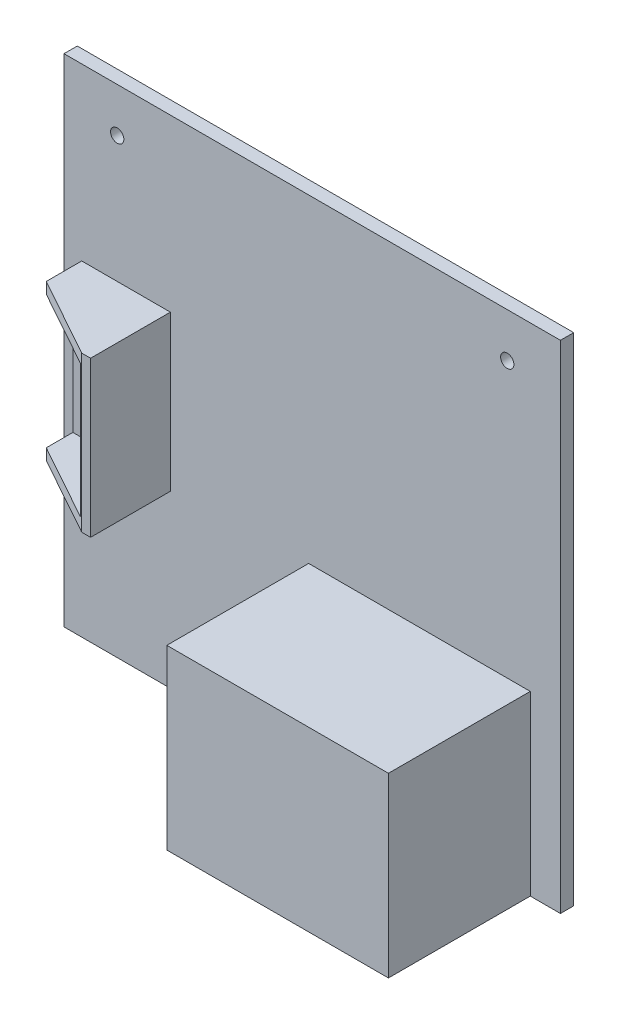
ISO-10303-21;
HEADER;
FILE_DESCRIPTION(('STEP AP214'),'2;1');
FILE_NAME('part.step','',(''),(''),'','','');
FILE_SCHEMA(('AUTOMOTIVE_DESIGN { 1 0 10303 214 1 1 1 1 }'));
ENDSEC;
DATA;
#1=APPLICATION_CONTEXT('core data for automotive mechanical design processes');
#2=APPLICATION_PROTOCOL_DEFINITION('international standard','automotive_design',2000,#1);
#3=PRODUCT_CONTEXT('',#1,'mechanical');
#4=PRODUCT('Part','Part','',(#3));
#5=PRODUCT_RELATED_PRODUCT_CATEGORY('part','',(#4));
#6=PRODUCT_DEFINITION_FORMATION('','',#4);
#7=PRODUCT_DEFINITION_CONTEXT('part definition',#1,'design');
#8=PRODUCT_DEFINITION('design','',#6,#7);
#9=PRODUCT_DEFINITION_SHAPE('','',#8);
#10=(LENGTH_UNIT() NAMED_UNIT(*) SI_UNIT(.MILLI.,.METRE.));
#11=(NAMED_UNIT(*) PLANE_ANGLE_UNIT() SI_UNIT($,.RADIAN.));
#12=(NAMED_UNIT(*) SI_UNIT($,.STERADIAN.) SOLID_ANGLE_UNIT());
#13=UNCERTAINTY_MEASURE_WITH_UNIT(LENGTH_MEASURE(1.E-05),#10,'distance_accuracy_value','');
#14=(GEOMETRIC_REPRESENTATION_CONTEXT(3) GLOBAL_UNCERTAINTY_ASSIGNED_CONTEXT((#13)) GLOBAL_UNIT_ASSIGNED_CONTEXT((#10,
#11,#12)) REPRESENTATION_CONTEXT('',''));
#15=CARTESIAN_POINT('',(0.,0.,0.));
#16=DIRECTION('',(0.,0.,1.));
#17=DIRECTION('',(1.,0.,0.));
#18=AXIS2_PLACEMENT_3D('',#15,#16,#17);
#19=CARTESIAN_POINT('',(56.,-56.,3.));
#20=DIRECTION('',(-1.,0.,0.));
#21=DIRECTION('',(0.,0.,1.));
#22=AXIS2_PLACEMENT_3D('',#19,#20,#21);
#23=PLANE('',#22);
#24=DIRECTION('',(0.,1.,0.));
#25=VECTOR('',#24,1.);
#26=CARTESIAN_POINT('',(56.,-56.,0.));
#27=LINE('',#26,#25);
#28=CARTESIAN_POINT('',(56.,-56.,0.));
#29=VERTEX_POINT('',#28);
#30=CARTESIAN_POINT('',(56.,56.,0.));
#31=VERTEX_POINT('',#30);
#32=EDGE_CURVE('E215',#29,#31,#27,.T.);
#33=ORIENTED_EDGE('',*,*,#32,.T.);
#34=DIRECTION('',(0.,0.,-1.));
#35=VECTOR('',#34,1.);
#36=CARTESIAN_POINT('',(56.,56.,3.));
#37=LINE('',#36,#35);
#38=CARTESIAN_POINT('',(56.,56.,3.));
#39=VERTEX_POINT('',#38);
#40=EDGE_CURVE('E46',#39,#31,#37,.T.);
#41=ORIENTED_EDGE('',*,*,#40,.F.);
#42=DIRECTION('',(0.,1.,0.));
#43=VECTOR('',#42,1.);
#44=CARTESIAN_POINT('',(56.,-56.,3.));
#45=LINE('',#44,#43);
#46=CARTESIAN_POINT('',(56.,-56.,3.));
#47=VERTEX_POINT('',#46);
#48=EDGE_CURVE('E216',#47,#39,#45,.T.);
#49=ORIENTED_EDGE('',*,*,#48,.F.);
#50=DIRECTION('',(0.,0.,-1.));
#51=VECTOR('',#50,1.);
#52=CARTESIAN_POINT('',(56.,-56.,3.));
#53=LINE('',#52,#51);
#54=EDGE_CURVE('E227',#47,#29,#53,.T.);
#55=ORIENTED_EDGE('',*,*,#54,.T.);
#56=EDGE_LOOP('',(#33,#41,#49,#55));
#57=FACE_BOUND('',#56,.T.);
#58=ADVANCED_FACE('F38',(#57),#23,.F.);
#59=CARTESIAN_POINT('',(-56.,56.,3.));
#60=DIRECTION('',(0.,-1.,0.));
#61=DIRECTION('',(0.,0.,-1.));
#62=AXIS2_PLACEMENT_3D('',#59,#60,#61);
#63=PLANE('',#62);
#64=DIRECTION('',(-1.,0.,0.));
#65=VECTOR('',#64,1.);
#66=CARTESIAN_POINT('',(-56.,56.,0.));
#67=LINE('',#66,#65);
#68=CARTESIAN_POINT('',(-56.,56.,0.));
#69=VERTEX_POINT('',#68);
#70=EDGE_CURVE('E230',#31,#69,#67,.T.);
#71=ORIENTED_EDGE('',*,*,#70,.T.);
#72=DIRECTION('',(0.,0.,-1.));
#73=VECTOR('',#72,1.);
#74=CARTESIAN_POINT('',(-56.,56.,3.));
#75=LINE('',#74,#73);
#76=CARTESIAN_POINT('',(-56.,56.,3.));
#77=VERTEX_POINT('',#76);
#78=EDGE_CURVE('E240',#77,#69,#75,.T.);
#79=ORIENTED_EDGE('',*,*,#78,.F.);
#80=DIRECTION('',(-1.,0.,0.));
#81=VECTOR('',#80,1.);
#82=CARTESIAN_POINT('',(-56.,56.,3.));
#83=LINE('',#82,#81);
#84=EDGE_CURVE('E219',#39,#77,#83,.T.);
#85=ORIENTED_EDGE('',*,*,#84,.F.);
#86=ORIENTED_EDGE('',*,*,#40,.T.);
#87=EDGE_LOOP('',(#71,#79,#85,#86));
#88=FACE_BOUND('',#87,.T.);
#89=ADVANCED_FACE('F285',(#88),#63,.F.);
#90=CARTESIAN_POINT('',(-56.,-56.,3.));
#91=DIRECTION('',(1.,0.,0.));
#92=DIRECTION('',(0.,0.,-1.));
#93=AXIS2_PLACEMENT_3D('',#90,#91,#92);
#94=PLANE('',#93);
#95=DIRECTION('',(0.,-1.,0.));
#96=VECTOR('',#95,1.);
#97=CARTESIAN_POINT('',(-56.,-56.,0.));
#98=LINE('',#97,#96);
#99=CARTESIAN_POINT('',(-56.,-56.,0.));
#100=VERTEX_POINT('',#99);
#101=EDGE_CURVE('E232',#69,#100,#98,.T.);
#102=ORIENTED_EDGE('',*,*,#101,.T.);
#103=DIRECTION('',(0.,0.,-1.));
#104=VECTOR('',#103,1.);
#105=CARTESIAN_POINT('',(-56.,-56.,3.));
#106=LINE('',#105,#104);
#107=CARTESIAN_POINT('',(-56.,-56.,3.));
#108=VERTEX_POINT('',#107);
#109=EDGE_CURVE('E237',#108,#100,#106,.T.);
#110=ORIENTED_EDGE('',*,*,#109,.F.);
#111=DIRECTION('',(0.,-1.,0.));
#112=VECTOR('',#111,1.);
#113=CARTESIAN_POINT('',(-56.,-56.,3.));
#114=LINE('',#113,#112);
#115=EDGE_CURVE('E222',#77,#108,#114,.T.);
#116=ORIENTED_EDGE('',*,*,#115,.F.);
#117=ORIENTED_EDGE('',*,*,#78,.T.);
#118=EDGE_LOOP('',(#102,#110,#116,#117));
#119=FACE_BOUND('',#118,.T.);
#120=ADVANCED_FACE('F282',(#119),#94,.F.);
#121=CARTESIAN_POINT('',(-56.,-56.,3.));
#122=DIRECTION('',(0.,1.,0.));
#123=DIRECTION('',(0.,0.,1.));
#124=AXIS2_PLACEMENT_3D('',#121,#122,#123);
#125=PLANE('',#124);
#126=DIRECTION('',(1.,0.,0.));
#127=VECTOR('',#126,1.);
#128=CARTESIAN_POINT('',(-56.,-56.,0.));
#129=LINE('',#128,#127);
#130=EDGE_CURVE('E220',#100,#29,#129,.T.);
#131=ORIENTED_EDGE('',*,*,#130,.T.);
#132=ORIENTED_EDGE('',*,*,#54,.F.);
#133=DIRECTION('',(1.,0.,0.));
#134=VECTOR('',#133,1.);
#135=CARTESIAN_POINT('',(-56.,-56.,3.));
#136=LINE('',#135,#134);
#137=CARTESIAN_POINT('',(49.197,-56.,3.));
#138=VERTEX_POINT('',#137);
#139=EDGE_CURVE('E224',#138,#47,#136,.T.);
#140=ORIENTED_EDGE('',*,*,#139,.F.);
#141=DIRECTION('',(0.,0.,-1.));
#142=VECTOR('',#141,1.);
#143=CARTESIAN_POINT('',(49.197,-56.,35.));
#144=LINE('',#143,#142);
#145=CARTESIAN_POINT('',(49.197,-56.,35.));
#146=VERTEX_POINT('',#145);
#147=EDGE_CURVE('E209',#146,#138,#144,.T.);
#148=ORIENTED_EDGE('',*,*,#147,.F.);
#149=DIRECTION('',(1.,0.,0.));
#150=VECTOR('',#149,1.);
#151=CARTESIAN_POINT('',(0.,-56.,35.));
#152=LINE('',#151,#150);
#153=CARTESIAN_POINT('',(-0.802999999999998,-56.,35.));
#154=VERTEX_POINT('',#153);
#155=EDGE_CURVE('E190',#154,#146,#152,.T.);
#156=ORIENTED_EDGE('',*,*,#155,.F.);
#157=DIRECTION('',(0.,0.,-1.));
#158=VECTOR('',#157,1.);
#159=CARTESIAN_POINT('',(-0.802999999999998,-56.,35.));
#160=LINE('',#159,#158);
#161=CARTESIAN_POINT('',(-0.802999999999998,-56.,3.));
#162=VERTEX_POINT('',#161);
#163=EDGE_CURVE('E212',#154,#162,#160,.T.);
#164=ORIENTED_EDGE('',*,*,#163,.T.);
#165=EDGE_CURVE('E225',#108,#162,#136,.T.);
#166=ORIENTED_EDGE('',*,*,#165,.F.);
#167=ORIENTED_EDGE('',*,*,#109,.T.);
#168=EDGE_LOOP('',(#131,#132,#140,#148,#156,#164,#166,#167));
#169=FACE_BOUND('',#168,.T.);
#170=ADVANCED_FACE('F276',(#169),#125,.F.);
#171=CARTESIAN_POINT('',(0.,0.,3.));
#172=DIRECTION('',(0.,0.,-1.));
#173=DIRECTION('',(-1.,0.,0.));
#174=AXIS2_PLACEMENT_3D('',#171,#172,#173);
#175=PLANE('',#174);
#176=CARTESIAN_POINT('',(-44.,46.,3.));
#177=DIRECTION('',(0.,0.,1.));
#178=DIRECTION('',(1.,0.,0.));
#179=AXIS2_PLACEMENT_3D('',#176,#177,#178);
#180=CIRCLE('',#179,1.5);
#181=CARTESIAN_POINT('',(-42.5,46.,3.));
#182=VERTEX_POINT('',#181);
#183=EDGE_CURVE('E248',#182,#182,#180,.T.);
#184=ORIENTED_EDGE('',*,*,#183,.F.);
#185=EDGE_LOOP('',(#184));
#186=FACE_BOUND('',#185,.T.);
#187=CARTESIAN_POINT('',(44.,46.,3.));
#188=DIRECTION('',(0.,0.,1.));
#189=DIRECTION('',(1.,0.,0.));
#190=AXIS2_PLACEMENT_3D('',#187,#188,#189);
#191=CIRCLE('',#190,1.5);
#192=CARTESIAN_POINT('',(45.5,46.,3.));
#193=VERTEX_POINT('',#192);
#194=EDGE_CURVE('E328',#193,#193,#191,.T.);
#195=ORIENTED_EDGE('',*,*,#194,.F.);
#196=EDGE_LOOP('',(#195));
#197=FACE_BOUND('',#196,.T.);
#198=CARTESIAN_POINT('',(-6.803,-46.,3.));
#199=DIRECTION('',(0.,0.,1.));
#200=DIRECTION('',(1.,0.,0.));
#201=AXIS2_PLACEMENT_3D('',#198,#199,#200);
#202=CIRCLE('',#201,1.5);
#203=CARTESIAN_POINT('',(-5.303,-46.,3.));
#204=VERTEX_POINT('',#203);
#205=EDGE_CURVE('E332',#204,#204,#202,.T.);
#206=ORIENTED_EDGE('',*,*,#205,.F.);
#207=EDGE_LOOP('',(#206));
#208=FACE_BOUND('',#207,.T.);
#209=DIRECTION('',(0.,1.,0.));
#210=VECTOR('',#209,1.);
#211=CARTESIAN_POINT('',(-52.,-17.5,3.));
#212=LINE('',#211,#210);
#213=CARTESIAN_POINT('',(-52.,-17.5,3.));
#214=VERTEX_POINT('',#213);
#215=CARTESIAN_POINT('',(-52.,17.5,3.));
#216=VERTEX_POINT('',#215);
#217=EDGE_CURVE('E176',#214,#216,#212,.T.);
#218=ORIENTED_EDGE('',*,*,#217,.T.);
#219=DIRECTION('',(1.,0.,0.));
#220=VECTOR('',#219,1.);
#221=CARTESIAN_POINT('',(-52.,17.5,3.));
#222=LINE('',#221,#220);
#223=CARTESIAN_POINT('',(-32.,17.5,3.));
#224=VERTEX_POINT('',#223);
#225=EDGE_CURVE('E336',#216,#224,#222,.T.);
#226=ORIENTED_EDGE('',*,*,#225,.T.);
#227=DIRECTION('',(0.,-1.,0.));
#228=VECTOR('',#227,1.);
#229=CARTESIAN_POINT('',(-32.,17.5,3.));
#230=LINE('',#229,#228);
#231=CARTESIAN_POINT('',(-32.,-17.5,3.));
#232=VERTEX_POINT('',#231);
#233=EDGE_CURVE('E340',#224,#232,#230,.T.);
#234=ORIENTED_EDGE('',*,*,#233,.T.);
#235=DIRECTION('',(1.,0.,0.));
#236=VECTOR('',#235,1.);
#237=CARTESIAN_POINT('',(-52.,-17.5,3.));
#238=LINE('',#237,#236);
#239=EDGE_CURVE('E61',#214,#232,#238,.T.);
#240=ORIENTED_EDGE('',*,*,#239,.F.);
#241=EDGE_LOOP('',(#218,#226,#234,#240));
#242=FACE_BOUND('',#241,.T.);
#243=ORIENTED_EDGE('',*,*,#165,.T.);
#244=DIRECTION('',(0.,1.,0.));
#245=VECTOR('',#244,1.);
#246=CARTESIAN_POINT('',(-0.802999999999998,0.,3.));
#247=LINE('',#246,#245);
#248=CARTESIAN_POINT('',(-0.802999999999998,-16.,3.));
#249=VERTEX_POINT('',#248);
#250=EDGE_CURVE('E180',#162,#249,#247,.T.);
#251=ORIENTED_EDGE('',*,*,#250,.T.);
#252=DIRECTION('',(-1.,0.,0.));
#253=VECTOR('',#252,1.);
#254=CARTESIAN_POINT('',(0.,-16.,3.));
#255=LINE('',#254,#253);
#256=CARTESIAN_POINT('',(49.197,-16.,3.));
#257=VERTEX_POINT('',#256);
#258=EDGE_CURVE('E191',#257,#249,#255,.T.);
#259=ORIENTED_EDGE('',*,*,#258,.F.);
#260=DIRECTION('',(0.,1.,0.));
#261=VECTOR('',#260,1.);
#262=CARTESIAN_POINT('',(49.197,0.,3.));
#263=LINE('',#262,#261);
#264=EDGE_CURVE('E199',#138,#257,#263,.T.);
#265=ORIENTED_EDGE('',*,*,#264,.F.);
#266=ORIENTED_EDGE('',*,*,#139,.T.);
#267=ORIENTED_EDGE('',*,*,#48,.T.);
#268=ORIENTED_EDGE('',*,*,#84,.T.);
#269=ORIENTED_EDGE('',*,*,#115,.T.);
#270=EDGE_LOOP('',(#243,#251,#259,#265,#266,#267,#268,#269));
#271=FACE_BOUND('',#270,.T.);
#272=ADVANCED_FACE('F262',(#186,#197,#208,#242,#271),#175,.F.);
#273=CARTESIAN_POINT('',(0.,0.,0.));
#274=DIRECTION('',(0.,0.,-1.));
#275=DIRECTION('',(-1.,0.,0.));
#276=AXIS2_PLACEMENT_3D('',#273,#274,#275);
#277=PLANE('',#276);
#278=CARTESIAN_POINT('',(-44.,46.,0.));
#279=DIRECTION('',(0.,0.,-1.));
#280=DIRECTION('',(-1.,0.,0.));
#281=AXIS2_PLACEMENT_3D('',#278,#279,#280);
#282=CIRCLE('',#281,1.5);
#283=CARTESIAN_POINT('',(-45.5,46.,0.));
#284=VERTEX_POINT('',#283);
#285=EDGE_CURVE('E41',#284,#284,#282,.T.);
#286=ORIENTED_EDGE('',*,*,#285,.F.);
#287=EDGE_LOOP('',(#286));
#288=FACE_BOUND('',#287,.T.);
#289=CARTESIAN_POINT('',(44.,46.,0.));
#290=DIRECTION('',(0.,0.,-1.));
#291=DIRECTION('',(-1.,0.,0.));
#292=AXIS2_PLACEMENT_3D('',#289,#290,#291);
#293=CIRCLE('',#292,1.5);
#294=CARTESIAN_POINT('',(42.5,46.,0.));
#295=VERTEX_POINT('',#294);
#296=EDGE_CURVE('E247',#295,#295,#293,.T.);
#297=ORIENTED_EDGE('',*,*,#296,.F.);
#298=EDGE_LOOP('',(#297));
#299=FACE_BOUND('',#298,.T.);
#300=CARTESIAN_POINT('',(-6.803,-46.,0.));
#301=DIRECTION('',(0.,0.,-1.));
#302=DIRECTION('',(-1.,0.,0.));
#303=AXIS2_PLACEMENT_3D('',#300,#301,#302);
#304=CIRCLE('',#303,1.5);
#305=CARTESIAN_POINT('',(-8.303,-46.,0.));
#306=VERTEX_POINT('',#305);
#307=EDGE_CURVE('E245',#306,#306,#304,.T.);
#308=ORIENTED_EDGE('',*,*,#307,.F.);
#309=EDGE_LOOP('',(#308));
#310=FACE_BOUND('',#309,.T.);
#311=ORIENTED_EDGE('',*,*,#32,.F.);
#312=ORIENTED_EDGE('',*,*,#130,.F.);
#313=ORIENTED_EDGE('',*,*,#101,.F.);
#314=ORIENTED_EDGE('',*,*,#70,.F.);
#315=EDGE_LOOP('',(#311,#312,#313,#314));
#316=FACE_BOUND('',#315,.T.);
#317=ADVANCED_FACE('F258',(#288,#299,#310,#316),#277,.T.);
#318=CARTESIAN_POINT('',(-0.802999999999998,0.,35.));
#319=DIRECTION('',(-1.,0.,0.));
#320=DIRECTION('',(0.,0.,1.));
#321=AXIS2_PLACEMENT_3D('',#318,#319,#320);
#322=PLANE('',#321);
#323=ORIENTED_EDGE('',*,*,#250,.F.);
#324=ORIENTED_EDGE('',*,*,#163,.F.);
#325=DIRECTION('',(0.,1.,0.));
#326=VECTOR('',#325,1.);
#327=CARTESIAN_POINT('',(-0.802999999999998,0.,35.));
#328=LINE('',#327,#326);
#329=CARTESIAN_POINT('',(-0.802999999999998,-16.,35.));
#330=VERTEX_POINT('',#329);
#331=EDGE_CURVE('E187',#154,#330,#328,.T.);
#332=ORIENTED_EDGE('',*,*,#331,.T.);
#333=DIRECTION('',(0.,0.,-1.));
#334=VECTOR('',#333,1.);
#335=CARTESIAN_POINT('',(-0.802999999999998,-16.,35.));
#336=LINE('',#335,#334);
#337=EDGE_CURVE('E197',#330,#249,#336,.T.);
#338=ORIENTED_EDGE('',*,*,#337,.T.);
#339=EDGE_LOOP('',(#323,#324,#332,#338));
#340=FACE_BOUND('',#339,.T.);
#341=ADVANCED_FACE('F261',(#340),#322,.T.);
#342=CARTESIAN_POINT('',(49.197,0.,35.));
#343=DIRECTION('',(-1.,0.,0.));
#344=DIRECTION('',(0.,0.,1.));
#345=AXIS2_PLACEMENT_3D('',#342,#343,#344);
#346=PLANE('',#345);
#347=ORIENTED_EDGE('',*,*,#264,.T.);
#348=DIRECTION('',(0.,0.,-1.));
#349=VECTOR('',#348,1.);
#350=CARTESIAN_POINT('',(49.197,-16.,35.));
#351=LINE('',#350,#349);
#352=CARTESIAN_POINT('',(49.197,-16.,35.));
#353=VERTEX_POINT('',#352);
#354=EDGE_CURVE('E206',#353,#257,#351,.T.);
#355=ORIENTED_EDGE('',*,*,#354,.F.);
#356=DIRECTION('',(0.,1.,0.));
#357=VECTOR('',#356,1.);
#358=CARTESIAN_POINT('',(49.197,0.,35.));
#359=LINE('',#358,#357);
#360=EDGE_CURVE('E193',#146,#353,#359,.T.);
#361=ORIENTED_EDGE('',*,*,#360,.F.);
#362=ORIENTED_EDGE('',*,*,#147,.T.);
#363=EDGE_LOOP('',(#347,#355,#361,#362));
#364=FACE_BOUND('',#363,.T.);
#365=ADVANCED_FACE('F289',(#364),#346,.F.);
#366=CARTESIAN_POINT('',(0.,-16.,35.));
#367=DIRECTION('',(0.,-1.,0.));
#368=DIRECTION('',(1.,0.,0.));
#369=AXIS2_PLACEMENT_3D('',#366,#367,#368);
#370=PLANE('',#369);
#371=ORIENTED_EDGE('',*,*,#258,.T.);
#372=ORIENTED_EDGE('',*,*,#337,.F.);
#373=DIRECTION('',(-1.,0.,0.));
#374=VECTOR('',#373,1.);
#375=CARTESIAN_POINT('',(0.,-16.,35.));
#376=LINE('',#375,#374);
#377=EDGE_CURVE('E195',#353,#330,#376,.T.);
#378=ORIENTED_EDGE('',*,*,#377,.F.);
#379=ORIENTED_EDGE('',*,*,#354,.T.);
#380=EDGE_LOOP('',(#371,#372,#378,#379));
#381=FACE_BOUND('',#380,.T.);
#382=ADVANCED_FACE('F293',(#381),#370,.F.);
#383=CARTESIAN_POINT('',(0.,0.,35.));
#384=DIRECTION('',(0.,0.,1.));
#385=DIRECTION('',(1.,0.,0.));
#386=AXIS2_PLACEMENT_3D('',#383,#384,#385);
#387=PLANE('',#386);
#388=ORIENTED_EDGE('',*,*,#331,.F.);
#389=ORIENTED_EDGE('',*,*,#155,.T.);
#390=ORIENTED_EDGE('',*,*,#360,.T.);
#391=ORIENTED_EDGE('',*,*,#377,.T.);
#392=EDGE_LOOP('',(#388,#389,#390,#391));
#393=FACE_BOUND('',#392,.T.);
#394=ADVANCED_FACE('F297',(#393),#387,.T.);
#395=CARTESIAN_POINT('',(-52.,17.5,21.));
#396=DIRECTION('',(0.,1.,0.));
#397=DIRECTION('',(-1.,0.,0.));
#398=AXIS2_PLACEMENT_3D('',#395,#396,#397);
#399=PLANE('',#398);
#400=DIRECTION('',(-0.874153865646997,0.,-0.485649069982031));
#401=VECTOR('',#400,1.);
#402=CARTESIAN_POINT('',(-47.7546798812734,17.5,13.3585501917441));
#403=LINE('',#402,#401);
#404=CARTESIAN_POINT('',(-34.0002977524627,17.5,21.));
#405=VERTEX_POINT('',#404);
#406=CARTESIAN_POINT('',(-52.,17.5,11.));
#407=VERTEX_POINT('',#406);
#408=EDGE_CURVE('E371',#405,#407,#403,.T.);
#409=ORIENTED_EDGE('',*,*,#408,.F.);
#410=DIRECTION('',(1.,0.,0.));
#411=VECTOR('',#410,1.);
#412=CARTESIAN_POINT('',(-52.,17.5,21.));
#413=LINE('',#412,#411);
#414=CARTESIAN_POINT('',(-32.,17.5,21.));
#415=VERTEX_POINT('',#414);
#416=EDGE_CURVE('E337',#405,#415,#413,.T.);
#417=ORIENTED_EDGE('',*,*,#416,.T.);
#418=DIRECTION('',(0.,0.,-1.));
#419=VECTOR('',#418,1.);
#420=CARTESIAN_POINT('',(-32.,17.5,21.));
#421=LINE('',#420,#419);
#422=EDGE_CURVE('E182',#415,#224,#421,.T.);
#423=ORIENTED_EDGE('',*,*,#422,.T.);
#424=ORIENTED_EDGE('',*,*,#225,.F.);
#425=DIRECTION('',(0.,0.,-1.));
#426=VECTOR('',#425,1.);
#427=CARTESIAN_POINT('',(-52.,17.5,21.));
#428=LINE('',#427,#426);
#429=EDGE_CURVE('E177',#407,#216,#428,.T.);
#430=ORIENTED_EDGE('',*,*,#429,.F.);
#431=EDGE_LOOP('',(#409,#417,#423,#424,#430));
#432=FACE_BOUND('',#431,.T.);
#433=ADVANCED_FACE('F418',(#432),#399,.T.);
#434=CARTESIAN_POINT('',(-52.,-17.5,21.));
#435=DIRECTION('',(-1.,0.,0.));
#436=DIRECTION('',(0.,0.,1.));
#437=AXIS2_PLACEMENT_3D('',#434,#435,#436);
#438=PLANE('',#437);
#439=DIRECTION('',(0.,-1.,0.));
#440=VECTOR('',#439,1.);
#441=CARTESIAN_POINT('',(-52.,28.5,11.));
#442=LINE('',#441,#440);
#443=CARTESIAN_POINT('',(-52.,15.,11.));
#444=VERTEX_POINT('',#443);
#445=EDGE_CURVE('E165',#407,#444,#442,.T.);
#446=ORIENTED_EDGE('',*,*,#445,.F.);
#447=ORIENTED_EDGE('',*,*,#429,.T.);
#448=ORIENTED_EDGE('',*,*,#217,.F.);
#449=DIRECTION('',(0.,0.,-1.));
#450=VECTOR('',#449,1.);
#451=CARTESIAN_POINT('',(-52.,-17.5,21.));
#452=LINE('',#451,#450);
#453=CARTESIAN_POINT('',(-52.,-17.5,11.));
#454=VERTEX_POINT('',#453);
#455=EDGE_CURVE('E169',#454,#214,#452,.T.);
#456=ORIENTED_EDGE('',*,*,#455,.F.);
#457=CARTESIAN_POINT('',(-52.,-15.,11.));
#458=VERTEX_POINT('',#457);
#459=EDGE_CURVE('E156',#458,#454,#442,.T.);
#460=ORIENTED_EDGE('',*,*,#459,.F.);
#461=DIRECTION('',(0.,0.,1.));
#462=VECTOR('',#461,1.);
#463=CARTESIAN_POINT('',(-52.,-15.,5.));
#464=LINE('',#463,#462);
#465=CARTESIAN_POINT('',(-52.,-15.,5.));
#466=VERTEX_POINT('',#465);
#467=EDGE_CURVE('E349',#466,#458,#464,.T.);
#468=ORIENTED_EDGE('',*,*,#467,.F.);
#469=DIRECTION('',(0.,-1.,0.));
#470=VECTOR('',#469,1.);
#471=CARTESIAN_POINT('',(-52.,-15.,5.));
#472=LINE('',#471,#470);
#473=CARTESIAN_POINT('',(-52.,15.,5.));
#474=VERTEX_POINT('',#473);
#475=EDGE_CURVE('E368',#474,#466,#472,.T.);
#476=ORIENTED_EDGE('',*,*,#475,.F.);
#477=DIRECTION('',(0.,0.,1.));
#478=VECTOR('',#477,1.);
#479=CARTESIAN_POINT('',(-52.,15.,5.));
#480=LINE('',#479,#478);
#481=EDGE_CURVE('E345',#474,#444,#480,.T.);
#482=ORIENTED_EDGE('',*,*,#481,.T.);
#483=EDGE_LOOP('',(#446,#447,#448,#456,#460,#468,#476,#482));
#484=FACE_BOUND('',#483,.T.);
#485=ADVANCED_FACE('F174',(#484),#438,.T.);
#486=CARTESIAN_POINT('',(-52.,-17.5,21.));
#487=DIRECTION('',(0.,1.,0.));
#488=DIRECTION('',(-1.,0.,0.));
#489=AXIS2_PLACEMENT_3D('',#486,#487,#488);
#490=PLANE('',#489);
#491=DIRECTION('',(1.,0.,0.));
#492=VECTOR('',#491,1.);
#493=CARTESIAN_POINT('',(-52.,-17.5,21.));
#494=LINE('',#493,#492);
#495=CARTESIAN_POINT('',(-34.0002977524627,-17.5,21.));
#496=VERTEX_POINT('',#495);
#497=CARTESIAN_POINT('',(-32.,-17.5,21.));
#498=VERTEX_POINT('',#497);
#499=EDGE_CURVE('E171',#496,#498,#494,.T.);
#500=ORIENTED_EDGE('',*,*,#499,.F.);
#501=DIRECTION('',(0.874153865646997,0.,0.485649069982031));
#502=VECTOR('',#501,1.);
#503=CARTESIAN_POINT('',(-16.9343131276687,-17.5,30.4812594064599));
#504=LINE('',#503,#502);
#505=EDGE_CURVE('E159',#454,#496,#504,.T.);
#506=ORIENTED_EDGE('',*,*,#505,.F.);
#507=ORIENTED_EDGE('',*,*,#455,.T.);
#508=ORIENTED_EDGE('',*,*,#239,.T.);
#509=DIRECTION('',(0.,0.,-1.));
#510=VECTOR('',#509,1.);
#511=CARTESIAN_POINT('',(-32.,-17.5,21.));
#512=LINE('',#511,#510);
#513=EDGE_CURVE('E178',#498,#232,#512,.T.);
#514=ORIENTED_EDGE('',*,*,#513,.F.);
#515=EDGE_LOOP('',(#500,#506,#507,#508,#514));
#516=FACE_BOUND('',#515,.T.);
#517=ADVANCED_FACE('F168',(#516),#490,.F.);
#518=CARTESIAN_POINT('',(-32.,17.5,21.));
#519=DIRECTION('',(1.,0.,0.));
#520=DIRECTION('',(0.,1.,0.));
#521=AXIS2_PLACEMENT_3D('',#518,#519,#520);
#522=PLANE('',#521);
#523=ORIENTED_EDGE('',*,*,#233,.F.);
#524=ORIENTED_EDGE('',*,*,#422,.F.);
#525=DIRECTION('',(0.,-1.,0.));
#526=VECTOR('',#525,1.);
#527=CARTESIAN_POINT('',(-32.,17.5,21.));
#528=LINE('',#527,#526);
#529=EDGE_CURVE('E338',#415,#498,#528,.T.);
#530=ORIENTED_EDGE('',*,*,#529,.T.);
#531=ORIENTED_EDGE('',*,*,#513,.T.);
#532=EDGE_LOOP('',(#523,#524,#530,#531));
#533=FACE_BOUND('',#532,.T.);
#534=ADVANCED_FACE('F414',(#533),#522,.T.);
#535=CARTESIAN_POINT('',(0.,0.,21.));
#536=DIRECTION('',(0.,0.,-1.));
#537=DIRECTION('',(-1.,0.,0.));
#538=AXIS2_PLACEMENT_3D('',#535,#536,#537);
#539=PLANE('',#538);
#540=ORIENTED_EDGE('',*,*,#416,.F.);
#541=DIRECTION('',(0.,-1.,0.));
#542=VECTOR('',#541,1.);
#543=CARTESIAN_POINT('',(-34.0002977524627,28.5,21.));
#544=LINE('',#543,#542);
#545=EDGE_CURVE('E376',#405,#496,#544,.T.);
#546=ORIENTED_EDGE('',*,*,#545,.T.);
#547=ORIENTED_EDGE('',*,*,#499,.T.);
#548=ORIENTED_EDGE('',*,*,#529,.F.);
#549=EDGE_LOOP('',(#540,#546,#547,#548));
#550=FACE_BOUND('',#549,.T.);
#551=ADVANCED_FACE('F404',(#550),#539,.F.);
#552=CARTESIAN_POINT('',(-52.,15.,5.));
#553=DIRECTION('',(0.,1.,0.));
#554=DIRECTION('',(-1.,0.,0.));
#555=AXIS2_PLACEMENT_3D('',#552,#553,#554);
#556=PLANE('',#555);
#557=DIRECTION('',(0.,0.,1.));
#558=VECTOR('',#557,1.);
#559=CARTESIAN_POINT('',(-34.5,15.,5.));
#560=LINE('',#559,#558);
#561=CARTESIAN_POINT('',(-34.5,15.,5.));
#562=VERTEX_POINT('',#561);
#563=CARTESIAN_POINT('',(-34.5,15.,20.722383047972));
#564=VERTEX_POINT('',#563);
#565=EDGE_CURVE('E355',#562,#564,#560,.T.);
#566=ORIENTED_EDGE('',*,*,#565,.T.);
#567=DIRECTION('',(-0.874153865646997,0.,-0.485649069982031));
#568=VECTOR('',#567,1.);
#569=CARTESIAN_POINT('',(-54.547192071236,15.,9.58486988495353));
#570=LINE('',#569,#568);
#571=EDGE_CURVE('E373',#564,#444,#570,.T.);
#572=ORIENTED_EDGE('',*,*,#571,.T.);
#573=ORIENTED_EDGE('',*,*,#481,.F.);
#574=DIRECTION('',(-1.,0.,0.));
#575=VECTOR('',#574,1.);
#576=CARTESIAN_POINT('',(-52.,15.,5.));
#577=LINE('',#576,#575);
#578=EDGE_CURVE('E352',#562,#474,#577,.T.);
#579=ORIENTED_EDGE('',*,*,#578,.F.);
#580=EDGE_LOOP('',(#566,#572,#573,#579));
#581=FACE_BOUND('',#580,.T.);
#582=ADVANCED_FACE('F400',(#581),#556,.F.);
#583=CARTESIAN_POINT('',(-34.5,15.,5.));
#584=DIRECTION('',(1.,0.,0.));
#585=DIRECTION('',(0.,1.,0.));
#586=AXIS2_PLACEMENT_3D('',#583,#584,#585);
#587=PLANE('',#586);
#588=DIRECTION('',(0.,0.,1.));
#589=VECTOR('',#588,1.);
#590=CARTESIAN_POINT('',(-34.5,-15.,5.));
#591=LINE('',#590,#589);
#592=CARTESIAN_POINT('',(-34.5,-15.,5.));
#593=VERTEX_POINT('',#592);
#594=CARTESIAN_POINT('',(-34.5,-15.,20.722383047972));
#595=VERTEX_POINT('',#594);
#596=EDGE_CURVE('E351',#593,#595,#591,.T.);
#597=ORIENTED_EDGE('',*,*,#596,.T.);
#598=DIRECTION('',(0.,1.,0.));
#599=VECTOR('',#598,1.);
#600=CARTESIAN_POINT('',(-34.5,15.,20.722383047972));
#601=LINE('',#600,#599);
#602=EDGE_CURVE('E54',#595,#564,#601,.T.);
#603=ORIENTED_EDGE('',*,*,#602,.T.);
#604=ORIENTED_EDGE('',*,*,#565,.F.);
#605=DIRECTION('',(0.,1.,0.));
#606=VECTOR('',#605,1.);
#607=CARTESIAN_POINT('',(-34.5,15.,5.));
#608=LINE('',#607,#606);
#609=EDGE_CURVE('E362',#593,#562,#608,.T.);
#610=ORIENTED_EDGE('',*,*,#609,.F.);
#611=EDGE_LOOP('',(#597,#603,#604,#610));
#612=FACE_BOUND('',#611,.T.);
#613=ADVANCED_FACE('F403',(#612),#587,.F.);
#614=CARTESIAN_POINT('',(-34.5,-15.,5.));
#615=DIRECTION('',(0.,-1.,0.));
#616=DIRECTION('',(1.,0.,0.));
#617=AXIS2_PLACEMENT_3D('',#614,#615,#616);
#618=PLANE('',#617);
#619=ORIENTED_EDGE('',*,*,#467,.T.);
#620=DIRECTION('',(0.874153865646997,0.,0.485649069982031));
#621=VECTOR('',#620,1.);
#622=CARTESIAN_POINT('',(-41.1746549067882,-15.,17.0141800927251));
#623=LINE('',#622,#621);
#624=EDGE_CURVE('E11',#458,#595,#623,.T.);
#625=ORIENTED_EDGE('',*,*,#624,.T.);
#626=ORIENTED_EDGE('',*,*,#596,.F.);
#627=DIRECTION('',(1.,0.,0.));
#628=VECTOR('',#627,1.);
#629=CARTESIAN_POINT('',(-34.5,-15.,5.));
#630=LINE('',#629,#628);
#631=EDGE_CURVE('E365',#466,#593,#630,.T.);
#632=ORIENTED_EDGE('',*,*,#631,.F.);
#633=EDGE_LOOP('',(#619,#625,#626,#632));
#634=FACE_BOUND('',#633,.T.);
#635=ADVANCED_FACE('F398',(#634),#618,.F.);
#636=CARTESIAN_POINT('',(0.,0.,5.));
#637=DIRECTION('',(0.,0.,-1.));
#638=DIRECTION('',(-1.,0.,0.));
#639=AXIS2_PLACEMENT_3D('',#636,#637,#638);
#640=PLANE('',#639);
#641=ORIENTED_EDGE('',*,*,#475,.T.);
#642=ORIENTED_EDGE('',*,*,#631,.T.);
#643=ORIENTED_EDGE('',*,*,#609,.T.);
#644=ORIENTED_EDGE('',*,*,#578,.T.);
#645=EDGE_LOOP('',(#641,#642,#643,#644));
#646=FACE_BOUND('',#645,.T.);
#647=ADVANCED_FACE('F395',(#646),#640,.F.);
#648=CARTESIAN_POINT('',(-16.9343131276687,28.5,30.4812594064599));
#649=DIRECTION('',(0.485649069982031,0.,-0.874153865646997));
#650=DIRECTION('',(-0.874153865646997,0.,-0.485649069982031));
#651=AXIS2_PLACEMENT_3D('',#648,#649,#650);
#652=PLANE('',#651);
#653=ORIENTED_EDGE('',*,*,#408,.T.);
#654=ORIENTED_EDGE('',*,*,#445,.T.);
#655=ORIENTED_EDGE('',*,*,#571,.F.);
#656=ORIENTED_EDGE('',*,*,#602,.F.);
#657=ORIENTED_EDGE('',*,*,#624,.F.);
#658=ORIENTED_EDGE('',*,*,#459,.T.);
#659=ORIENTED_EDGE('',*,*,#505,.T.);
#660=ORIENTED_EDGE('',*,*,#545,.F.);
#661=EDGE_LOOP('',(#653,#654,#655,#656,#657,#658,#659,#660));
#662=FACE_BOUND('',#661,.T.);
#663=ADVANCED_FACE('F158',(#662),#652,.F.);
#664=CARTESIAN_POINT('',(-6.803,-46.,-43.));
#665=DIRECTION('',(0.,0.,1.));
#666=DIRECTION('',(1.,0.,0.));
#667=AXIS2_PLACEMENT_3D('',#664,#665,#666);
#668=CYLINDRICAL_SURFACE('',#667,1.5);
#669=ORIENTED_EDGE('',*,*,#307,.T.);
#670=EDGE_LOOP('',(#669));
#671=FACE_BOUND('',#670,.T.);
#672=ORIENTED_EDGE('',*,*,#205,.T.);
#673=EDGE_LOOP('',(#672));
#674=FACE_BOUND('',#673,.T.);
#675=ADVANCED_FACE('F387',(#671,#674),#668,.F.);
#676=CARTESIAN_POINT('',(44.,46.,-43.));
#677=DIRECTION('',(0.,0.,1.));
#678=DIRECTION('',(1.,0.,0.));
#679=AXIS2_PLACEMENT_3D('',#676,#677,#678);
#680=CYLINDRICAL_SURFACE('',#679,1.5);
#681=ORIENTED_EDGE('',*,*,#296,.T.);
#682=EDGE_LOOP('',(#681));
#683=FACE_BOUND('',#682,.T.);
#684=ORIENTED_EDGE('',*,*,#194,.T.);
#685=EDGE_LOOP('',(#684));
#686=FACE_BOUND('',#685,.T.);
#687=ADVANCED_FACE('F382',(#683,#686),#680,.F.);
#688=CARTESIAN_POINT('',(-44.,46.,-43.));
#689=DIRECTION('',(0.,0.,1.));
#690=DIRECTION('',(1.,0.,0.));
#691=AXIS2_PLACEMENT_3D('',#688,#689,#690);
#692=CYLINDRICAL_SURFACE('',#691,1.5);
#693=ORIENTED_EDGE('',*,*,#285,.T.);
#694=EDGE_LOOP('',(#693));
#695=FACE_BOUND('',#694,.T.);
#696=ORIENTED_EDGE('',*,*,#183,.T.);
#697=EDGE_LOOP('',(#696));
#698=FACE_BOUND('',#697,.T.);
#699=ADVANCED_FACE('F255',(#695,#698),#692,.F.);
#700=CLOSED_SHELL('',(#58,#89,#120,#170,#272,#317,#341,#365,#382,#394,#433,#485,#517,#534,#551,
#582,#613,#635,#647,#663,#675,#687,#699));
#701=MANIFOLD_SOLID_BREP('B2',#700);
#702=ADVANCED_BREP_SHAPE_REPRESENTATION('',(#18,#701),#14);
#703=SHAPE_DEFINITION_REPRESENTATION(#9,#702);
ENDSEC;
END-ISO-10303-21;
